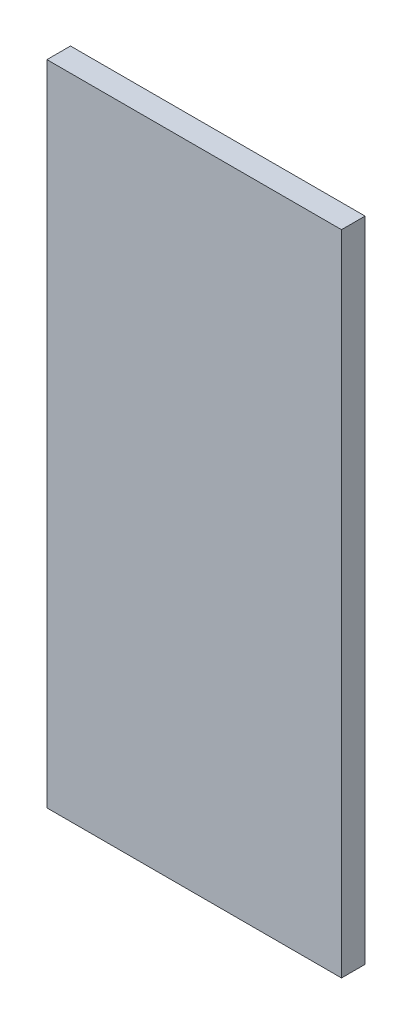
ISO-10303-21;
HEADER;
FILE_DESCRIPTION(('STEP AP214'),'2;1');
FILE_NAME('part.step','',(''),(''),'','','');
FILE_SCHEMA(('AUTOMOTIVE_DESIGN { 1 0 10303 214 1 1 1 1 }'));
ENDSEC;
DATA;
#1=APPLICATION_CONTEXT('core data for automotive mechanical design processes');
#2=APPLICATION_PROTOCOL_DEFINITION('international standard','automotive_design',2000,#1);
#3=PRODUCT_CONTEXT('',#1,'mechanical');
#4=PRODUCT('Part','Part','',(#3));
#5=PRODUCT_RELATED_PRODUCT_CATEGORY('part','',(#4));
#6=PRODUCT_DEFINITION_FORMATION('','',#4);
#7=PRODUCT_DEFINITION_CONTEXT('part definition',#1,'design');
#8=PRODUCT_DEFINITION('design','',#6,#7);
#9=PRODUCT_DEFINITION_SHAPE('','',#8);
#10=(LENGTH_UNIT() NAMED_UNIT(*) SI_UNIT(.MILLI.,.METRE.));
#11=(NAMED_UNIT(*) PLANE_ANGLE_UNIT() SI_UNIT($,.RADIAN.));
#12=(NAMED_UNIT(*) SI_UNIT($,.STERADIAN.) SOLID_ANGLE_UNIT());
#13=UNCERTAINTY_MEASURE_WITH_UNIT(LENGTH_MEASURE(1.E-05),#10,'distance_accuracy_value','');
#14=(GEOMETRIC_REPRESENTATION_CONTEXT(3) GLOBAL_UNCERTAINTY_ASSIGNED_CONTEXT((#13)) GLOBAL_UNIT_ASSIGNED_CONTEXT((#10,
#11,#12)) REPRESENTATION_CONTEXT('',''));
#15=CARTESIAN_POINT('',(0.,0.,0.));
#16=DIRECTION('',(0.,0.,1.));
#17=DIRECTION('',(1.,0.,0.));
#18=AXIS2_PLACEMENT_3D('',#15,#16,#17);
#19=CARTESIAN_POINT('',(-12.5,-27.5,2.));
#20=DIRECTION('',(1.,0.,0.));
#21=DIRECTION('',(0.,1.,0.));
#22=AXIS2_PLACEMENT_3D('',#19,#20,#21);
#23=PLANE('',#22);
#24=DIRECTION('',(0.,-1.,0.));
#25=VECTOR('',#24,1.);
#26=CARTESIAN_POINT('',(-12.5,-27.5,0.));
#27=LINE('',#26,#25);
#28=CARTESIAN_POINT('',(-12.5,27.5,0.));
#29=VERTEX_POINT('',#28);
#30=CARTESIAN_POINT('',(-12.5,-27.5,0.));
#31=VERTEX_POINT('',#30);
#32=EDGE_CURVE('E96',#29,#31,#27,.T.);
#33=ORIENTED_EDGE('',*,*,#32,.T.);
#34=DIRECTION('',(0.,0.,-1.));
#35=VECTOR('',#34,1.);
#36=CARTESIAN_POINT('',(-12.5,-27.5,2.));
#37=LINE('',#36,#35);
#38=CARTESIAN_POINT('',(-12.5,-27.5,2.));
#39=VERTEX_POINT('',#38);
#40=EDGE_CURVE('E11',#39,#31,#37,.T.);
#41=ORIENTED_EDGE('',*,*,#40,.F.);
#42=DIRECTION('',(0.,-1.,0.));
#43=VECTOR('',#42,1.);
#44=CARTESIAN_POINT('',(-12.5,-27.5,2.));
#45=LINE('',#44,#43);
#46=CARTESIAN_POINT('',(-12.5,27.5,2.));
#47=VERTEX_POINT('',#46);
#48=EDGE_CURVE('E84',#47,#39,#45,.T.);
#49=ORIENTED_EDGE('',*,*,#48,.F.);
#50=DIRECTION('',(0.,0.,-1.));
#51=VECTOR('',#50,1.);
#52=CARTESIAN_POINT('',(-12.5,27.5,2.));
#53=LINE('',#52,#51);
#54=EDGE_CURVE('E92',#47,#29,#53,.T.);
#55=ORIENTED_EDGE('',*,*,#54,.T.);
#56=EDGE_LOOP('',(#33,#41,#49,#55));
#57=FACE_BOUND('',#56,.T.);
#58=ADVANCED_FACE('F33',(#57),#23,.F.);
#59=CARTESIAN_POINT('',(12.5,-27.5,2.));
#60=DIRECTION('',(0.,1.,0.));
#61=DIRECTION('',(-1.,0.,0.));
#62=AXIS2_PLACEMENT_3D('',#59,#60,#61);
#63=PLANE('',#62);
#64=DIRECTION('',(1.,0.,0.));
#65=VECTOR('',#64,1.);
#66=CARTESIAN_POINT('',(12.5,-27.5,0.));
#67=LINE('',#66,#65);
#68=CARTESIAN_POINT('',(12.5,-27.5,0.));
#69=VERTEX_POINT('',#68);
#70=EDGE_CURVE('E88',#31,#69,#67,.T.);
#71=ORIENTED_EDGE('',*,*,#70,.T.);
#72=DIRECTION('',(0.,0.,-1.));
#73=VECTOR('',#72,1.);
#74=CARTESIAN_POINT('',(12.5,-27.5,2.));
#75=LINE('',#74,#73);
#76=CARTESIAN_POINT('',(12.5,-27.5,2.));
#77=VERTEX_POINT('',#76);
#78=EDGE_CURVE('E41',#77,#69,#75,.T.);
#79=ORIENTED_EDGE('',*,*,#78,.F.);
#80=DIRECTION('',(1.,0.,0.));
#81=VECTOR('',#80,1.);
#82=CARTESIAN_POINT('',(12.5,-27.5,2.));
#83=LINE('',#82,#81);
#84=EDGE_CURVE('E79',#39,#77,#83,.T.);
#85=ORIENTED_EDGE('',*,*,#84,.F.);
#86=ORIENTED_EDGE('',*,*,#40,.T.);
#87=EDGE_LOOP('',(#71,#79,#85,#86));
#88=FACE_BOUND('',#87,.T.);
#89=ADVANCED_FACE('F87',(#88),#63,.F.);
#90=CARTESIAN_POINT('',(12.5,-27.5,2.));
#91=DIRECTION('',(-1.,0.,0.));
#92=DIRECTION('',(0.,0.,1.));
#93=AXIS2_PLACEMENT_3D('',#90,#91,#92);
#94=PLANE('',#93);
#95=DIRECTION('',(0.,1.,0.));
#96=VECTOR('',#95,1.);
#97=CARTESIAN_POINT('',(12.5,-27.5,0.));
#98=LINE('',#97,#96);
#99=CARTESIAN_POINT('',(12.5,27.5,0.));
#100=VERTEX_POINT('',#99);
#101=EDGE_CURVE('E66',#69,#100,#98,.T.);
#102=ORIENTED_EDGE('',*,*,#101,.T.);
#103=DIRECTION('',(0.,0.,-1.));
#104=VECTOR('',#103,1.);
#105=CARTESIAN_POINT('',(12.5,27.5,2.));
#106=LINE('',#105,#104);
#107=CARTESIAN_POINT('',(12.5,27.5,2.));
#108=VERTEX_POINT('',#107);
#109=EDGE_CURVE('E89',#108,#100,#106,.T.);
#110=ORIENTED_EDGE('',*,*,#109,.F.);
#111=DIRECTION('',(0.,1.,0.));
#112=VECTOR('',#111,1.);
#113=CARTESIAN_POINT('',(12.5,-27.5,2.));
#114=LINE('',#113,#112);
#115=EDGE_CURVE('E82',#77,#108,#114,.T.);
#116=ORIENTED_EDGE('',*,*,#115,.F.);
#117=ORIENTED_EDGE('',*,*,#78,.T.);
#118=EDGE_LOOP('',(#102,#110,#116,#117));
#119=FACE_BOUND('',#118,.T.);
#120=ADVANCED_FACE('F90',(#119),#94,.F.);
#121=CARTESIAN_POINT('',(12.5,27.5,2.));
#122=DIRECTION('',(0.,-1.,0.));
#123=DIRECTION('',(0.,0.,-1.));
#124=AXIS2_PLACEMENT_3D('',#121,#122,#123);
#125=PLANE('',#124);
#126=DIRECTION('',(-1.,0.,0.));
#127=VECTOR('',#126,1.);
#128=CARTESIAN_POINT('',(12.5,27.5,0.));
#129=LINE('',#128,#127);
#130=EDGE_CURVE('E72',#100,#29,#129,.T.);
#131=ORIENTED_EDGE('',*,*,#130,.T.);
#132=ORIENTED_EDGE('',*,*,#54,.F.);
#133=DIRECTION('',(-1.,0.,0.));
#134=VECTOR('',#133,1.);
#135=CARTESIAN_POINT('',(12.5,27.5,2.));
#136=LINE('',#135,#134);
#137=EDGE_CURVE('E49',#108,#47,#136,.T.);
#138=ORIENTED_EDGE('',*,*,#137,.F.);
#139=ORIENTED_EDGE('',*,*,#109,.T.);
#140=EDGE_LOOP('',(#131,#132,#138,#139));
#141=FACE_BOUND('',#140,.T.);
#142=ADVANCED_FACE('F103',(#141),#125,.F.);
#143=CARTESIAN_POINT('',(0.,0.,2.));
#144=DIRECTION('',(0.,0.,1.));
#145=DIRECTION('',(1.,0.,0.));
#146=AXIS2_PLACEMENT_3D('',#143,#144,#145);
#147=PLANE('',#146);
#148=ORIENTED_EDGE('',*,*,#48,.T.);
#149=ORIENTED_EDGE('',*,*,#84,.T.);
#150=ORIENTED_EDGE('',*,*,#115,.T.);
#151=ORIENTED_EDGE('',*,*,#137,.T.);
#152=EDGE_LOOP('',(#148,#149,#150,#151));
#153=FACE_BOUND('',#152,.T.);
#154=ADVANCED_FACE('F80',(#153),#147,.T.);
#155=CARTESIAN_POINT('',(0.,0.,0.));
#156=DIRECTION('',(0.,0.,1.));
#157=DIRECTION('',(1.,0.,0.));
#158=AXIS2_PLACEMENT_3D('',#155,#156,#157);
#159=PLANE('',#158);
#160=ORIENTED_EDGE('',*,*,#32,.F.);
#161=ORIENTED_EDGE('',*,*,#130,.F.);
#162=ORIENTED_EDGE('',*,*,#101,.F.);
#163=ORIENTED_EDGE('',*,*,#70,.F.);
#164=EDGE_LOOP('',(#160,#161,#162,#163));
#165=FACE_BOUND('',#164,.T.);
#166=ADVANCED_FACE('F106',(#165),#159,.F.);
#167=CLOSED_SHELL('',(#58,#89,#120,#142,#154,#166));
#168=MANIFOLD_SOLID_BREP('B2',#167);
#169=ADVANCED_BREP_SHAPE_REPRESENTATION('',(#18,#168),#14);
#170=SHAPE_DEFINITION_REPRESENTATION(#9,#169);
ENDSEC;
END-ISO-10303-21;
